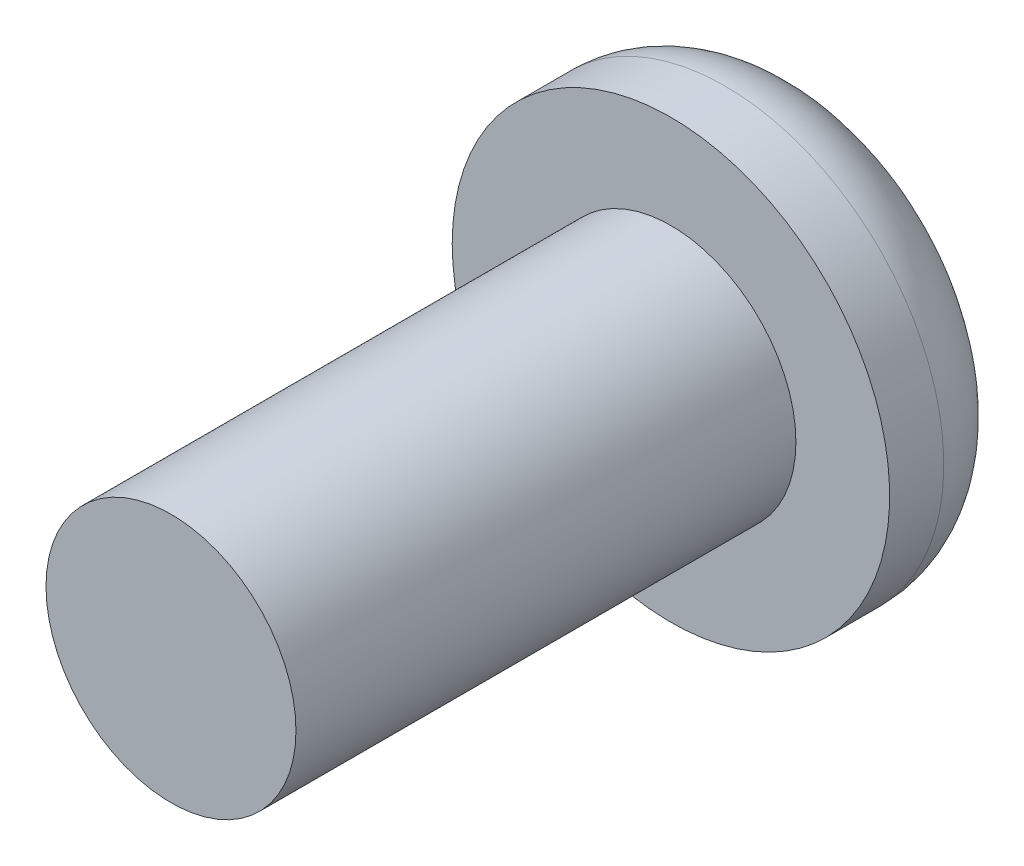
ISO-10303-21;
HEADER;
FILE_DESCRIPTION(('STEP AP214'),'2;1');
FILE_NAME('part.step','',(''),(''),'','','');
FILE_SCHEMA(('AUTOMOTIVE_DESIGN { 1 0 10303 214 1 1 1 1 }'));
ENDSEC;
DATA;
#1=APPLICATION_CONTEXT('core data for automotive mechanical design processes');
#2=APPLICATION_PROTOCOL_DEFINITION('international standard','automotive_design',2000,#1);
#3=PRODUCT_CONTEXT('',#1,'mechanical');
#4=PRODUCT('Part','Part','',(#3));
#5=PRODUCT_RELATED_PRODUCT_CATEGORY('part','',(#4));
#6=PRODUCT_DEFINITION_FORMATION('','',#4);
#7=PRODUCT_DEFINITION_CONTEXT('part definition',#1,'design');
#8=PRODUCT_DEFINITION('design','',#6,#7);
#9=PRODUCT_DEFINITION_SHAPE('','',#8);
#10=(LENGTH_UNIT() NAMED_UNIT(*) SI_UNIT(.MILLI.,.METRE.));
#11=(NAMED_UNIT(*) PLANE_ANGLE_UNIT() SI_UNIT($,.RADIAN.));
#12=(NAMED_UNIT(*) SI_UNIT($,.STERADIAN.) SOLID_ANGLE_UNIT());
#13=UNCERTAINTY_MEASURE_WITH_UNIT(LENGTH_MEASURE(1.E-05),#10,'distance_accuracy_value','');
#14=(GEOMETRIC_REPRESENTATION_CONTEXT(3) GLOBAL_UNCERTAINTY_ASSIGNED_CONTEXT((#13)) GLOBAL_UNIT_ASSIGNED_CONTEXT((#10,
#11,#12)) REPRESENTATION_CONTEXT('',''));
#15=CARTESIAN_POINT('',(0.,0.,0.));
#16=DIRECTION('',(0.,0.,1.));
#17=DIRECTION('',(1.,0.,0.));
#18=AXIS2_PLACEMENT_3D('',#15,#16,#17);
#19=CARTESIAN_POINT('',(0.,0.,12.));
#20=DIRECTION('',(0.,0.,-1.));
#21=DIRECTION('',(-1.,0.,0.));
#22=AXIS2_PLACEMENT_3D('',#19,#20,#21);
#23=CYLINDRICAL_SURFACE('',#22,3.);
#24=CARTESIAN_POINT('',(0.,0.,12.));
#25=DIRECTION('',(0.,0.,1.));
#26=DIRECTION('',(1.,0.,0.));
#27=AXIS2_PLACEMENT_3D('',#24,#25,#26);
#28=CIRCLE('',#27,3.);
#29=CARTESIAN_POINT('',(3.,0.,12.));
#30=VERTEX_POINT('',#29);
#31=EDGE_CURVE('E50',#30,#30,#28,.T.);
#32=ORIENTED_EDGE('',*,*,#31,.F.);
#33=EDGE_LOOP('',(#32));
#34=FACE_BOUND('',#33,.T.);
#35=CARTESIAN_POINT('',(0.,0.,0.));
#36=DIRECTION('',(0.,0.,1.));
#37=DIRECTION('',(1.,0.,0.));
#38=AXIS2_PLACEMENT_3D('',#35,#36,#37);
#39=CIRCLE('',#38,3.);
#40=CARTESIAN_POINT('',(3.,0.,0.));
#41=VERTEX_POINT('',#40);
#42=EDGE_CURVE('E55',#41,#41,#39,.T.);
#43=ORIENTED_EDGE('',*,*,#42,.T.);
#44=EDGE_LOOP('',(#43));
#45=FACE_BOUND('',#44,.T.);
#46=ADVANCED_FACE('F37',(#34,#45),#23,.T.);
#47=CARTESIAN_POINT('',(0.,0.,12.));
#48=DIRECTION('',(0.,0.,1.));
#49=DIRECTION('',(1.,0.,0.));
#50=AXIS2_PLACEMENT_3D('',#47,#48,#49);
#51=PLANE('',#50);
#52=ORIENTED_EDGE('',*,*,#31,.T.);
#53=EDGE_LOOP('',(#52));
#54=FACE_BOUND('',#53,.T.);
#55=ADVANCED_FACE('F82',(#54),#51,.T.);
#56=CARTESIAN_POINT('',(0.,0.,-3.3));
#57=DIRECTION('',(0.,0.,1.));
#58=DIRECTION('',(1.,0.,0.));
#59=AXIS2_PLACEMENT_3D('',#56,#57,#58);
#60=CYLINDRICAL_SURFACE('',#59,5.25);
#61=CARTESIAN_POINT('',(0.,0.,-1.3));
#62=DIRECTION('',(0.,0.,-1.));
#63=DIRECTION('',(-1.,0.,0.));
#64=AXIS2_PLACEMENT_3D('',#61,#62,#63);
#65=CIRCLE('',#64,5.25);
#66=CARTESIAN_POINT('',(-5.25,0.,-1.3));
#67=VERTEX_POINT('',#66);
#68=EDGE_CURVE('E10',#67,#67,#65,.F.);
#69=ORIENTED_EDGE('',*,*,#68,.T.);
#70=EDGE_LOOP('',(#69));
#71=FACE_BOUND('',#70,.T.);
#72=CARTESIAN_POINT('',(0.,0.,0.));
#73=DIRECTION('',(0.,0.,-1.));
#74=DIRECTION('',(-1.,0.,0.));
#75=AXIS2_PLACEMENT_3D('',#72,#73,#74);
#76=CIRCLE('',#75,5.25);
#77=CARTESIAN_POINT('',(-5.25,0.,0.));
#78=VERTEX_POINT('',#77);
#79=EDGE_CURVE('E60',#78,#78,#76,.T.);
#80=ORIENTED_EDGE('',*,*,#79,.T.);
#81=EDGE_LOOP('',(#80));
#82=FACE_BOUND('',#81,.T.);
#83=ADVANCED_FACE('F66',(#71,#82),#60,.T.);
#84=CARTESIAN_POINT('',(0.,0.,-3.3));
#85=DIRECTION('',(0.,0.,-1.));
#86=DIRECTION('',(-1.,0.,0.));
#87=AXIS2_PLACEMENT_3D('',#84,#85,#86);
#88=PLANE('',#87);
#89=CARTESIAN_POINT('',(0.,0.,-3.3));
#90=DIRECTION('',(0.,0.,-1.));
#91=DIRECTION('',(-1.,0.,0.));
#92=AXIS2_PLACEMENT_3D('',#89,#90,#91);
#93=CIRCLE('',#92,3.25);
#94=CARTESIAN_POINT('',(-3.25,0.,-3.3));
#95=VERTEX_POINT('',#94);
#96=EDGE_CURVE('E45',#95,#95,#93,.T.);
#97=ORIENTED_EDGE('',*,*,#96,.T.);
#98=EDGE_LOOP('',(#97));
#99=FACE_BOUND('',#98,.T.);
#100=ADVANCED_FACE('F70',(#99),#88,.T.);
#101=CARTESIAN_POINT('',(0.,0.,0.));
#102=DIRECTION('',(0.,0.,-1.));
#103=DIRECTION('',(-1.,0.,0.));
#104=AXIS2_PLACEMENT_3D('',#101,#102,#103);
#105=PLANE('',#104);
#106=ORIENTED_EDGE('',*,*,#42,.F.);
#107=EDGE_LOOP('',(#106));
#108=FACE_BOUND('',#107,.T.);
#109=ORIENTED_EDGE('',*,*,#79,.F.);
#110=EDGE_LOOP('',(#109));
#111=FACE_BOUND('',#110,.T.);
#112=ADVANCED_FACE('F68',(#108,#111),#105,.F.);
#113=CARTESIAN_POINT('',(0.,0.,-1.3));
#114=DIRECTION('',(0.,0.,-1.));
#115=DIRECTION('',(-1.,0.,0.));
#116=AXIS2_PLACEMENT_3D('',#113,#114,#115);
#117=TOROIDAL_SURFACE('',#116,3.25,2.);
#118=ORIENTED_EDGE('',*,*,#68,.F.);
#119=EDGE_LOOP('',(#118));
#120=FACE_BOUND('',#119,.T.);
#121=ORIENTED_EDGE('',*,*,#96,.F.);
#122=EDGE_LOOP('',(#121));
#123=FACE_BOUND('',#122,.T.);
#124=ADVANCED_FACE('F39',(#120,#123),#117,.T.);
#125=CLOSED_SHELL('',(#46,#55,#83,#100,#112,#124));
#126=MANIFOLD_SOLID_BREP('B2',#125);
#127=ADVANCED_BREP_SHAPE_REPRESENTATION('',(#18,#126),#14);
#128=SHAPE_DEFINITION_REPRESENTATION(#9,#127);
ENDSEC;
END-ISO-10303-21;
